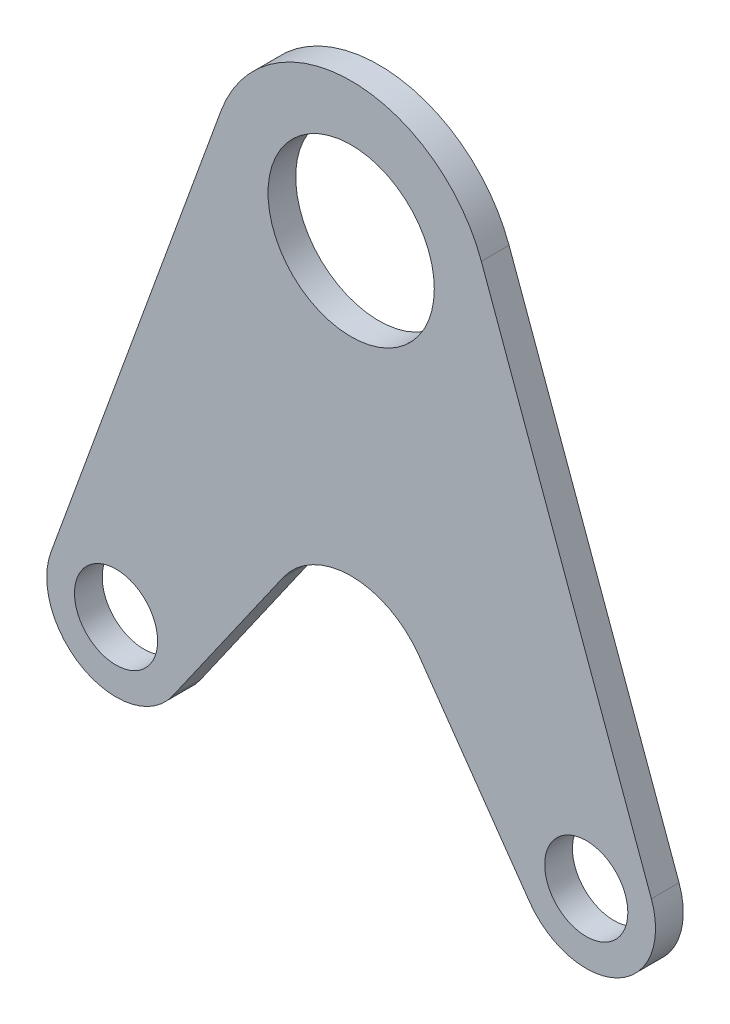
ISO-10303-21;
HEADER;
FILE_DESCRIPTION(('STEP AP214'),'2;1');
FILE_NAME('part.step','',(''),(''),'','','');
FILE_SCHEMA(('AUTOMOTIVE_DESIGN { 1 0 10303 214 1 1 1 1 }'));
ENDSEC;
DATA;
#1=APPLICATION_CONTEXT('core data for automotive mechanical design processes');
#2=APPLICATION_PROTOCOL_DEFINITION('international standard','automotive_design',2000,#1);
#3=PRODUCT_CONTEXT('',#1,'mechanical');
#4=PRODUCT('Part','Part','',(#3));
#5=PRODUCT_RELATED_PRODUCT_CATEGORY('part','',(#4));
#6=PRODUCT_DEFINITION_FORMATION('','',#4);
#7=PRODUCT_DEFINITION_CONTEXT('part definition',#1,'design');
#8=PRODUCT_DEFINITION('design','',#6,#7);
#9=PRODUCT_DEFINITION_SHAPE('','',#8);
#10=(LENGTH_UNIT() NAMED_UNIT(*) SI_UNIT(.MILLI.,.METRE.));
#11=(NAMED_UNIT(*) PLANE_ANGLE_UNIT() SI_UNIT($,.RADIAN.));
#12=(NAMED_UNIT(*) SI_UNIT($,.STERADIAN.) SOLID_ANGLE_UNIT());
#13=UNCERTAINTY_MEASURE_WITH_UNIT(LENGTH_MEASURE(1.E-05),#10,'distance_accuracy_value','');
#14=(GEOMETRIC_REPRESENTATION_CONTEXT(3) GLOBAL_UNCERTAINTY_ASSIGNED_CONTEXT((#13)) GLOBAL_UNIT_ASSIGNED_CONTEXT((#10,
#11,#12)) REPRESENTATION_CONTEXT('',''));
#15=CARTESIAN_POINT('',(0.,0.,0.));
#16=DIRECTION('',(0.,0.,1.));
#17=DIRECTION('',(1.,0.,0.));
#18=AXIS2_PLACEMENT_3D('',#15,#16,#17);
#19=CARTESIAN_POINT('',(84.8396817944904,-160.,10.));
#20=DIRECTION('',(0.,0.,1.));
#21=DIRECTION('',(1.,0.,0.));
#22=AXIS2_PLACEMENT_3D('',#19,#20,#21);
#23=PLANE('',#22);
#24=CARTESIAN_POINT('',(-84.8396817944897,-160.,10.));
#25=DIRECTION('',(0.,0.,1.));
#26=DIRECTION('',(1.,0.,0.));
#27=AXIS2_PLACEMENT_3D('',#24,#25,#26);
#28=CIRCLE('',#27,15.);
#29=CARTESIAN_POINT('',(-69.8396817944897,-160.,10.));
#30=VERTEX_POINT('',#29);
#31=EDGE_CURVE('E182',#30,#30,#28,.T.);
#32=ORIENTED_EDGE('',*,*,#31,.F.);
#33=EDGE_LOOP('',(#32));
#34=FACE_BOUND('',#33,.T.);
#35=CARTESIAN_POINT('',(84.8396817944904,-160.,10.));
#36=DIRECTION('',(0.,0.,1.));
#37=DIRECTION('',(1.,0.,0.));
#38=AXIS2_PLACEMENT_3D('',#35,#36,#37);
#39=CIRCLE('',#38,25.);
#40=CARTESIAN_POINT('',(64.3608806872656,-174.339410908776,10.));
#41=VERTEX_POINT('',#40);
#42=CARTESIAN_POINT('',(108.331997314138,-151.449496416858,10.));
#43=VERTEX_POINT('',#42);
#44=EDGE_CURVE('E145',#41,#43,#39,.T.);
#45=ORIENTED_EDGE('',*,*,#44,.T.);
#46=DIRECTION('',(-0.34202014332567,0.939692620785908,0.));
#47=VECTOR('',#46,1.);
#48=CARTESIAN_POINT('',(46.9846310392954,17.1010071662835,10.));
#49=LINE('',#48,#47);
#50=CARTESIAN_POINT('',(46.9846310392954,17.1010071662835,10.));
#51=VERTEX_POINT('',#50);
#52=EDGE_CURVE('E93',#43,#51,#49,.T.);
#53=ORIENTED_EDGE('',*,*,#52,.T.);
#54=CARTESIAN_POINT('',(0.,0.,10.));
#55=DIRECTION('',(0.,0.,1.));
#56=DIRECTION('',(1.,0.,0.));
#57=AXIS2_PLACEMENT_3D('',#54,#55,#56);
#58=CIRCLE('',#57,50.);
#59=CARTESIAN_POINT('',(-46.9846310392955,17.1010071662833,10.));
#60=VERTEX_POINT('',#59);
#61=EDGE_CURVE('E160',#51,#60,#58,.T.);
#62=ORIENTED_EDGE('',*,*,#61,.T.);
#63=DIRECTION('',(-0.342020143325667,-0.939692620785909,0.));
#64=VECTOR('',#63,1.);
#65=CARTESIAN_POINT('',(-46.9846310392955,17.1010071662833,10.));
#66=LINE('',#65,#64);
#67=CARTESIAN_POINT('',(-108.331997314137,-151.449496416858,10.));
#68=VERTEX_POINT('',#67);
#69=EDGE_CURVE('E173',#60,#68,#66,.T.);
#70=ORIENTED_EDGE('',*,*,#69,.T.);
#71=CARTESIAN_POINT('',(-84.8396817944897,-160.,10.));
#72=DIRECTION('',(0.,0.,1.));
#73=DIRECTION('',(1.,0.,0.));
#74=AXIS2_PLACEMENT_3D('',#71,#72,#73);
#75=CIRCLE('',#74,25.);
#76=CARTESIAN_POINT('',(-64.3608806872649,-174.339410908776,10.));
#77=VERTEX_POINT('',#76);
#78=EDGE_CURVE('E112',#68,#77,#75,.T.);
#79=ORIENTED_EDGE('',*,*,#78,.T.);
#80=DIRECTION('',(0.573576436351042,0.819152044288995,0.));
#81=VECTOR('',#80,1.);
#82=CARTESIAN_POINT('',(-64.3608806872649,-174.339410908776,10.));
#83=LINE('',#82,#81);
#84=CARTESIAN_POINT('',(-24.5745613286698,-117.518658221193,10.));
#85=VERTEX_POINT('',#84);
#86=EDGE_CURVE('E106',#77,#85,#83,.T.);
#87=ORIENTED_EDGE('',*,*,#86,.T.);
#88=CARTESIAN_POINT('',(0.,-134.725951311724,10.));
#89=DIRECTION('',(0.,0.,-1.));
#90=DIRECTION('',(-1.,0.,0.));
#91=AXIS2_PLACEMENT_3D('',#88,#89,#90);
#92=CIRCLE('',#91,30.);
#93=CARTESIAN_POINT('',(24.5745613286697,-117.518658221192,10.));
#94=VERTEX_POINT('',#93);
#95=EDGE_CURVE('E110',#85,#94,#92,.T.);
#96=ORIENTED_EDGE('',*,*,#95,.T.);
#97=DIRECTION('',(0.573576436351047,-0.819152044288991,0.));
#98=VECTOR('',#97,1.);
#99=CARTESIAN_POINT('',(24.5745613286697,-117.518658221192,10.));
#100=LINE('',#99,#98);
#101=EDGE_CURVE('E50',#94,#41,#100,.T.);
#102=ORIENTED_EDGE('',*,*,#101,.T.);
#103=EDGE_LOOP('',(#45,#53,#62,#70,#79,#87,#96,#102));
#104=FACE_BOUND('',#103,.T.);
#105=CARTESIAN_POINT('',(0.,0.,10.));
#106=DIRECTION('',(0.,0.,1.));
#107=DIRECTION('',(1.,0.,0.));
#108=AXIS2_PLACEMENT_3D('',#105,#106,#107);
#109=CIRCLE('',#108,30.);
#110=CARTESIAN_POINT('',(30.,0.,10.));
#111=VERTEX_POINT('',#110);
#112=EDGE_CURVE('E134',#111,#111,#109,.T.);
#113=ORIENTED_EDGE('',*,*,#112,.F.);
#114=EDGE_LOOP('',(#113));
#115=FACE_BOUND('',#114,.T.);
#116=CARTESIAN_POINT('',(84.8396817944904,-160.,10.));
#117=DIRECTION('',(0.,0.,1.));
#118=DIRECTION('',(1.,0.,0.));
#119=AXIS2_PLACEMENT_3D('',#116,#117,#118);
#120=CIRCLE('',#119,15.);
#121=CARTESIAN_POINT('',(99.8396817944903,-160.,10.));
#122=VERTEX_POINT('',#121);
#123=EDGE_CURVE('E188',#122,#122,#120,.T.);
#124=ORIENTED_EDGE('',*,*,#123,.F.);
#125=EDGE_LOOP('',(#124));
#126=FACE_BOUND('',#125,.T.);
#127=ADVANCED_FACE('F33',(#34,#104,#115,#126),#23,.T.);
#128=CARTESIAN_POINT('',(84.8396817944904,-160.,0.));
#129=DIRECTION('',(0.,0.,1.));
#130=DIRECTION('',(1.,0.,0.));
#131=AXIS2_PLACEMENT_3D('',#128,#129,#130);
#132=PLANE('',#131);
#133=CARTESIAN_POINT('',(84.8396817944904,-160.,0.));
#134=DIRECTION('',(0.,0.,1.));
#135=DIRECTION('',(1.,0.,0.));
#136=AXIS2_PLACEMENT_3D('',#133,#134,#135);
#137=CIRCLE('',#136,25.);
#138=CARTESIAN_POINT('',(64.3608806872656,-174.339410908776,0.));
#139=VERTEX_POINT('',#138);
#140=CARTESIAN_POINT('',(108.331997314138,-151.449496416858,0.));
#141=VERTEX_POINT('',#140);
#142=EDGE_CURVE('E130',#139,#141,#137,.T.);
#143=ORIENTED_EDGE('',*,*,#142,.F.);
#144=DIRECTION('',(0.573576436351047,-0.819152044288991,0.));
#145=VECTOR('',#144,1.);
#146=CARTESIAN_POINT('',(24.5745613286697,-117.518658221192,0.));
#147=LINE('',#146,#145);
#148=CARTESIAN_POINT('',(24.5745613286697,-117.518658221192,0.));
#149=VERTEX_POINT('',#148);
#150=EDGE_CURVE('E85',#149,#139,#147,.T.);
#151=ORIENTED_EDGE('',*,*,#150,.F.);
#152=CARTESIAN_POINT('',(0.,-134.725951311724,0.));
#153=DIRECTION('',(0.,0.,-1.));
#154=DIRECTION('',(-1.,0.,0.));
#155=AXIS2_PLACEMENT_3D('',#152,#153,#154);
#156=CIRCLE('',#155,30.);
#157=CARTESIAN_POINT('',(-24.5745613286698,-117.518658221193,0.));
#158=VERTEX_POINT('',#157);
#159=EDGE_CURVE('E79',#158,#149,#156,.T.);
#160=ORIENTED_EDGE('',*,*,#159,.F.);
#161=DIRECTION('',(0.573576436351042,0.819152044288995,0.));
#162=VECTOR('',#161,1.);
#163=CARTESIAN_POINT('',(-64.3608806872649,-174.339410908776,0.));
#164=LINE('',#163,#162);
#165=CARTESIAN_POINT('',(-64.3608806872649,-174.339410908776,0.));
#166=VERTEX_POINT('',#165);
#167=EDGE_CURVE('E120',#166,#158,#164,.T.);
#168=ORIENTED_EDGE('',*,*,#167,.F.);
#169=CARTESIAN_POINT('',(-84.8396817944897,-160.,0.));
#170=DIRECTION('',(0.,0.,1.));
#171=DIRECTION('',(1.,0.,0.));
#172=AXIS2_PLACEMENT_3D('',#169,#170,#171);
#173=CIRCLE('',#172,25.);
#174=CARTESIAN_POINT('',(-108.331997314137,-151.449496416858,0.));
#175=VERTEX_POINT('',#174);
#176=EDGE_CURVE('E140',#175,#166,#173,.T.);
#177=ORIENTED_EDGE('',*,*,#176,.F.);
#178=DIRECTION('',(-0.342020143325667,-0.939692620785909,0.));
#179=VECTOR('',#178,1.);
#180=CARTESIAN_POINT('',(-46.9846310392955,17.1010071662833,0.));
#181=LINE('',#180,#179);
#182=CARTESIAN_POINT('',(-46.9846310392955,17.1010071662833,0.));
#183=VERTEX_POINT('',#182);
#184=EDGE_CURVE('E138',#183,#175,#181,.T.);
#185=ORIENTED_EDGE('',*,*,#184,.F.);
#186=CARTESIAN_POINT('',(0.,0.,0.));
#187=DIRECTION('',(0.,0.,1.));
#188=DIRECTION('',(1.,0.,0.));
#189=AXIS2_PLACEMENT_3D('',#186,#187,#188);
#190=CIRCLE('',#189,50.);
#191=CARTESIAN_POINT('',(46.9846310392954,17.1010071662835,0.));
#192=VERTEX_POINT('',#191);
#193=EDGE_CURVE('E136',#192,#183,#190,.T.);
#194=ORIENTED_EDGE('',*,*,#193,.F.);
#195=DIRECTION('',(-0.34202014332567,0.939692620785908,0.));
#196=VECTOR('',#195,1.);
#197=CARTESIAN_POINT('',(46.9846310392954,17.1010071662835,0.));
#198=LINE('',#197,#196);
#199=EDGE_CURVE('E133',#141,#192,#198,.T.);
#200=ORIENTED_EDGE('',*,*,#199,.F.);
#201=EDGE_LOOP('',(#143,#151,#160,#168,#177,#185,#194,#200));
#202=FACE_BOUND('',#201,.T.);
#203=CARTESIAN_POINT('',(0.,0.,0.));
#204=DIRECTION('',(0.,0.,1.));
#205=DIRECTION('',(1.,0.,0.));
#206=AXIS2_PLACEMENT_3D('',#203,#204,#205);
#207=CIRCLE('',#206,30.);
#208=CARTESIAN_POINT('',(30.,0.,0.));
#209=VERTEX_POINT('',#208);
#210=EDGE_CURVE('E179',#209,#209,#207,.T.);
#211=ORIENTED_EDGE('',*,*,#210,.T.);
#212=EDGE_LOOP('',(#211));
#213=FACE_BOUND('',#212,.T.);
#214=CARTESIAN_POINT('',(-84.8396817944897,-160.,0.));
#215=DIRECTION('',(0.,0.,1.));
#216=DIRECTION('',(1.,0.,0.));
#217=AXIS2_PLACEMENT_3D('',#214,#215,#216);
#218=CIRCLE('',#217,15.);
#219=CARTESIAN_POINT('',(-69.8396817944897,-160.,0.));
#220=VERTEX_POINT('',#219);
#221=EDGE_CURVE('E185',#220,#220,#218,.T.);
#222=ORIENTED_EDGE('',*,*,#221,.T.);
#223=EDGE_LOOP('',(#222));
#224=FACE_BOUND('',#223,.T.);
#225=CARTESIAN_POINT('',(84.8396817944904,-160.,0.));
#226=DIRECTION('',(0.,0.,1.));
#227=DIRECTION('',(1.,0.,0.));
#228=AXIS2_PLACEMENT_3D('',#225,#226,#227);
#229=CIRCLE('',#228,15.);
#230=CARTESIAN_POINT('',(99.8396817944903,-160.,0.));
#231=VERTEX_POINT('',#230);
#232=EDGE_CURVE('E191',#231,#231,#229,.T.);
#233=ORIENTED_EDGE('',*,*,#232,.T.);
#234=EDGE_LOOP('',(#233));
#235=FACE_BOUND('',#234,.T.);
#236=ADVANCED_FACE('F164',(#202,#213,#224,#235),#132,.F.);
#237=CARTESIAN_POINT('',(84.8396817944904,-160.,10.));
#238=DIRECTION('',(0.,0.,-1.));
#239=DIRECTION('',(-1.,0.,0.));
#240=AXIS2_PLACEMENT_3D('',#237,#238,#239);
#241=CYLINDRICAL_SURFACE('',#240,25.);
#242=ORIENTED_EDGE('',*,*,#142,.T.);
#243=DIRECTION('',(0.,0.,-1.));
#244=VECTOR('',#243,1.);
#245=CARTESIAN_POINT('',(108.331997314138,-151.449496416858,10.));
#246=LINE('',#245,#244);
#247=EDGE_CURVE('E11',#43,#141,#246,.T.);
#248=ORIENTED_EDGE('',*,*,#247,.F.);
#249=ORIENTED_EDGE('',*,*,#44,.F.);
#250=DIRECTION('',(0.,0.,-1.));
#251=VECTOR('',#250,1.);
#252=CARTESIAN_POINT('',(64.3608806872656,-174.339410908776,10.));
#253=LINE('',#252,#251);
#254=EDGE_CURVE('E126',#41,#139,#253,.T.);
#255=ORIENTED_EDGE('',*,*,#254,.T.);
#256=EDGE_LOOP('',(#242,#248,#249,#255));
#257=FACE_BOUND('',#256,.T.);
#258=ADVANCED_FACE('F35',(#257),#241,.T.);
#259=CARTESIAN_POINT('',(46.9846310392954,17.1010071662835,10.));
#260=DIRECTION('',(-0.939692620785908,-0.34202014332567,0.));
#261=DIRECTION('',(0.34202014332567,-0.939692620785908,0.));
#262=AXIS2_PLACEMENT_3D('',#259,#260,#261);
#263=PLANE('',#262);
#264=ORIENTED_EDGE('',*,*,#199,.T.);
#265=DIRECTION('',(0.,0.,-1.));
#266=VECTOR('',#265,1.);
#267=CARTESIAN_POINT('',(46.9846310392954,17.1010071662835,10.));
#268=LINE('',#267,#266);
#269=EDGE_CURVE('E42',#51,#192,#268,.T.);
#270=ORIENTED_EDGE('',*,*,#269,.F.);
#271=ORIENTED_EDGE('',*,*,#52,.F.);
#272=ORIENTED_EDGE('',*,*,#247,.T.);
#273=EDGE_LOOP('',(#264,#270,#271,#272));
#274=FACE_BOUND('',#273,.T.);
#275=ADVANCED_FACE('F224',(#274),#263,.F.);
#276=CARTESIAN_POINT('',(0.,0.,10.));
#277=DIRECTION('',(0.,0.,-1.));
#278=DIRECTION('',(-1.,0.,0.));
#279=AXIS2_PLACEMENT_3D('',#276,#277,#278);
#280=CYLINDRICAL_SURFACE('',#279,50.);
#281=ORIENTED_EDGE('',*,*,#193,.T.);
#282=DIRECTION('',(0.,0.,-1.));
#283=VECTOR('',#282,1.);
#284=CARTESIAN_POINT('',(-46.9846310392955,17.1010071662833,10.));
#285=LINE('',#284,#283);
#286=EDGE_CURVE('E152',#60,#183,#285,.T.);
#287=ORIENTED_EDGE('',*,*,#286,.F.);
#288=ORIENTED_EDGE('',*,*,#61,.F.);
#289=ORIENTED_EDGE('',*,*,#269,.T.);
#290=EDGE_LOOP('',(#281,#287,#288,#289));
#291=FACE_BOUND('',#290,.T.);
#292=ADVANCED_FACE('F158',(#291),#280,.T.);
#293=CARTESIAN_POINT('',(-46.9846310392955,17.1010071662833,10.));
#294=DIRECTION('',(0.939692620785909,-0.342020143325667,0.));
#295=DIRECTION('',(0.342020143325667,0.939692620785909,0.));
#296=AXIS2_PLACEMENT_3D('',#293,#294,#295);
#297=PLANE('',#296);
#298=ORIENTED_EDGE('',*,*,#184,.T.);
#299=DIRECTION('',(0.,0.,-1.));
#300=VECTOR('',#299,1.);
#301=CARTESIAN_POINT('',(-108.331997314137,-151.449496416858,10.));
#302=LINE('',#301,#300);
#303=EDGE_CURVE('E149',#68,#175,#302,.T.);
#304=ORIENTED_EDGE('',*,*,#303,.F.);
#305=ORIENTED_EDGE('',*,*,#69,.F.);
#306=ORIENTED_EDGE('',*,*,#286,.T.);
#307=EDGE_LOOP('',(#298,#304,#305,#306));
#308=FACE_BOUND('',#307,.T.);
#309=ADVANCED_FACE('F169',(#308),#297,.F.);
#310=CARTESIAN_POINT('',(-84.8396817944897,-160.,10.));
#311=DIRECTION('',(0.,0.,-1.));
#312=DIRECTION('',(-1.,0.,0.));
#313=AXIS2_PLACEMENT_3D('',#310,#311,#312);
#314=CYLINDRICAL_SURFACE('',#313,25.);
#315=ORIENTED_EDGE('',*,*,#176,.T.);
#316=DIRECTION('',(0.,0.,-1.));
#317=VECTOR('',#316,1.);
#318=CARTESIAN_POINT('',(-64.3608806872649,-174.339410908776,10.));
#319=LINE('',#318,#317);
#320=EDGE_CURVE('E121',#77,#166,#319,.T.);
#321=ORIENTED_EDGE('',*,*,#320,.F.);
#322=ORIENTED_EDGE('',*,*,#78,.F.);
#323=ORIENTED_EDGE('',*,*,#303,.T.);
#324=EDGE_LOOP('',(#315,#321,#322,#323));
#325=FACE_BOUND('',#324,.T.);
#326=ADVANCED_FACE('F172',(#325),#314,.T.);
#327=CARTESIAN_POINT('',(-64.3608806872649,-174.339410908776,10.));
#328=DIRECTION('',(-0.819152044288995,0.573576436351042,0.));
#329=DIRECTION('',(-0.573576436351042,-0.819152044288995,0.));
#330=AXIS2_PLACEMENT_3D('',#327,#328,#329);
#331=PLANE('',#330);
#332=ORIENTED_EDGE('',*,*,#167,.T.);
#333=DIRECTION('',(0.,0.,-1.));
#334=VECTOR('',#333,1.);
#335=CARTESIAN_POINT('',(-24.5745613286698,-117.518658221193,10.));
#336=LINE('',#335,#334);
#337=EDGE_CURVE('E117',#85,#158,#336,.T.);
#338=ORIENTED_EDGE('',*,*,#337,.F.);
#339=ORIENTED_EDGE('',*,*,#86,.F.);
#340=ORIENTED_EDGE('',*,*,#320,.T.);
#341=EDGE_LOOP('',(#332,#338,#339,#340));
#342=FACE_BOUND('',#341,.T.);
#343=ADVANCED_FACE('F118',(#342),#331,.F.);
#344=CARTESIAN_POINT('',(0.,-134.725951311724,10.));
#345=DIRECTION('',(0.,0.,-1.));
#346=DIRECTION('',(-1.,0.,0.));
#347=AXIS2_PLACEMENT_3D('',#344,#345,#346);
#348=CYLINDRICAL_SURFACE('',#347,30.);
#349=ORIENTED_EDGE('',*,*,#159,.T.);
#350=DIRECTION('',(0.,0.,-1.));
#351=VECTOR('',#350,1.);
#352=CARTESIAN_POINT('',(24.5745613286697,-117.518658221192,10.));
#353=LINE('',#352,#351);
#354=EDGE_CURVE('E122',#94,#149,#353,.T.);
#355=ORIENTED_EDGE('',*,*,#354,.F.);
#356=ORIENTED_EDGE('',*,*,#95,.F.);
#357=ORIENTED_EDGE('',*,*,#337,.T.);
#358=EDGE_LOOP('',(#349,#355,#356,#357));
#359=FACE_BOUND('',#358,.T.);
#360=ADVANCED_FACE('F124',(#359),#348,.F.);
#361=CARTESIAN_POINT('',(24.5745613286697,-117.518658221192,10.));
#362=DIRECTION('',(0.819152044288991,0.573576436351047,0.));
#363=DIRECTION('',(-0.573576436351047,0.819152044288991,0.));
#364=AXIS2_PLACEMENT_3D('',#361,#362,#363);
#365=PLANE('',#364);
#366=ORIENTED_EDGE('',*,*,#150,.T.);
#367=ORIENTED_EDGE('',*,*,#254,.F.);
#368=ORIENTED_EDGE('',*,*,#101,.F.);
#369=ORIENTED_EDGE('',*,*,#354,.T.);
#370=EDGE_LOOP('',(#366,#367,#368,#369));
#371=FACE_BOUND('',#370,.T.);
#372=ADVANCED_FACE('F212',(#371),#365,.F.);
#373=CARTESIAN_POINT('',(0.,0.,10.));
#374=DIRECTION('',(0.,0.,-1.));
#375=DIRECTION('',(-1.,0.,0.));
#376=AXIS2_PLACEMENT_3D('',#373,#374,#375);
#377=CYLINDRICAL_SURFACE('',#376,30.);
#378=ORIENTED_EDGE('',*,*,#112,.T.);
#379=EDGE_LOOP('',(#378));
#380=FACE_BOUND('',#379,.T.);
#381=ORIENTED_EDGE('',*,*,#210,.F.);
#382=EDGE_LOOP('',(#381));
#383=FACE_BOUND('',#382,.T.);
#384=ADVANCED_FACE('F209',(#380,#383),#377,.F.);
#385=CARTESIAN_POINT('',(-84.8396817944897,-160.,10.));
#386=DIRECTION('',(0.,0.,-1.));
#387=DIRECTION('',(-1.,0.,0.));
#388=AXIS2_PLACEMENT_3D('',#385,#386,#387);
#389=CYLINDRICAL_SURFACE('',#388,15.);
#390=ORIENTED_EDGE('',*,*,#31,.T.);
#391=EDGE_LOOP('',(#390));
#392=FACE_BOUND('',#391,.T.);
#393=ORIENTED_EDGE('',*,*,#221,.F.);
#394=EDGE_LOOP('',(#393));
#395=FACE_BOUND('',#394,.T.);
#396=ADVANCED_FACE('F288',(#392,#395),#389,.F.);
#397=CARTESIAN_POINT('',(84.8396817944904,-160.,10.));
#398=DIRECTION('',(0.,0.,-1.));
#399=DIRECTION('',(-1.,0.,0.));
#400=AXIS2_PLACEMENT_3D('',#397,#398,#399);
#401=CYLINDRICAL_SURFACE('',#400,15.);
#402=ORIENTED_EDGE('',*,*,#123,.T.);
#403=EDGE_LOOP('',(#402));
#404=FACE_BOUND('',#403,.T.);
#405=ORIENTED_EDGE('',*,*,#232,.F.);
#406=EDGE_LOOP('',(#405));
#407=FACE_BOUND('',#406,.T.);
#408=ADVANCED_FACE('F197',(#404,#407),#401,.F.);
#409=CLOSED_SHELL('',(#127,#236,#258,#275,#292,#309,#326,#343,#360,#372,#384,#396,#408));
#410=MANIFOLD_SOLID_BREP('B2',#409);
#411=ADVANCED_BREP_SHAPE_REPRESENTATION('',(#18,#410),#14);
#412=SHAPE_DEFINITION_REPRESENTATION(#9,#411);
ENDSEC;
END-ISO-10303-21;
